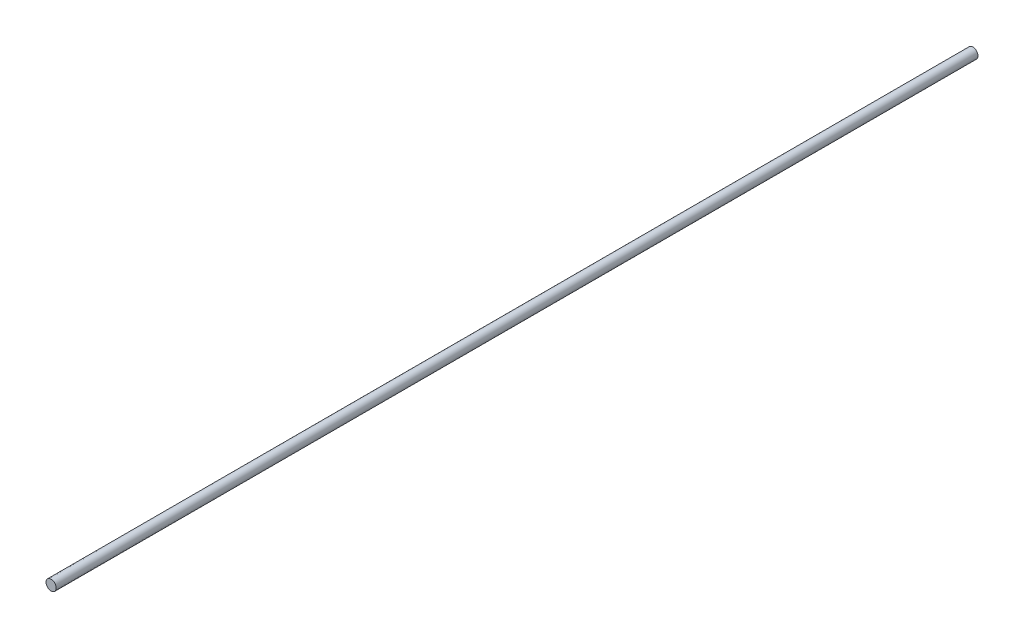
ISO-10303-21;
HEADER;
FILE_DESCRIPTION(('STEP AP214'),'2;1');
FILE_NAME('part.step','',(''),(''),'','','');
FILE_SCHEMA(('AUTOMOTIVE_DESIGN { 1 0 10303 214 1 1 1 1 }'));
ENDSEC;
DATA;
#1=APPLICATION_CONTEXT('core data for automotive mechanical design processes');
#2=APPLICATION_PROTOCOL_DEFINITION('international standard','automotive_design',2000,#1);
#3=PRODUCT_CONTEXT('',#1,'mechanical');
#4=PRODUCT('Part','Part','',(#3));
#5=PRODUCT_RELATED_PRODUCT_CATEGORY('part','',(#4));
#6=PRODUCT_DEFINITION_FORMATION('','',#4);
#7=PRODUCT_DEFINITION_CONTEXT('part definition',#1,'design');
#8=PRODUCT_DEFINITION('design','',#6,#7);
#9=PRODUCT_DEFINITION_SHAPE('','',#8);
#10=(LENGTH_UNIT() NAMED_UNIT(*) SI_UNIT(.MILLI.,.METRE.));
#11=(NAMED_UNIT(*) PLANE_ANGLE_UNIT() SI_UNIT($,.RADIAN.));
#12=(NAMED_UNIT(*) SI_UNIT($,.STERADIAN.) SOLID_ANGLE_UNIT());
#13=UNCERTAINTY_MEASURE_WITH_UNIT(LENGTH_MEASURE(1.E-05),#10,'distance_accuracy_value','');
#14=(GEOMETRIC_REPRESENTATION_CONTEXT(3) GLOBAL_UNCERTAINTY_ASSIGNED_CONTEXT((#13)) GLOBAL_UNIT_ASSIGNED_CONTEXT((#10,
#11,#12)) REPRESENTATION_CONTEXT('',''));
#15=CARTESIAN_POINT('',(0.,0.,0.));
#16=DIRECTION('',(0.,0.,1.));
#17=DIRECTION('',(1.,0.,0.));
#18=AXIS2_PLACEMENT_3D('',#15,#16,#17);
#19=CARTESIAN_POINT('',(0.,0.,450.));
#20=DIRECTION('',(0.,0.,-1.));
#21=DIRECTION('',(-1.,0.,0.));
#22=AXIS2_PLACEMENT_3D('',#19,#20,#21);
#23=CYLINDRICAL_SURFACE('',#22,5.);
#24=CARTESIAN_POINT('',(0.,0.,450.));
#25=DIRECTION('',(0.,0.,1.));
#26=DIRECTION('',(1.,0.,0.));
#27=AXIS2_PLACEMENT_3D('',#24,#25,#26);
#28=CIRCLE('',#27,5.);
#29=CARTESIAN_POINT('',(5.,0.,450.));
#30=VERTEX_POINT('',#29);
#31=EDGE_CURVE('E10',#30,#30,#28,.T.);
#32=ORIENTED_EDGE('',*,*,#31,.F.);
#33=EDGE_LOOP('',(#32));
#34=FACE_BOUND('',#33,.T.);
#35=CARTESIAN_POINT('',(0.,0.,-450.));
#36=DIRECTION('',(0.,0.,1.));
#37=DIRECTION('',(1.,0.,0.));
#38=AXIS2_PLACEMENT_3D('',#35,#36,#37);
#39=CIRCLE('',#38,5.);
#40=CARTESIAN_POINT('',(5.,0.,-450.));
#41=VERTEX_POINT('',#40);
#42=EDGE_CURVE('E44',#41,#41,#39,.T.);
#43=ORIENTED_EDGE('',*,*,#42,.T.);
#44=EDGE_LOOP('',(#43));
#45=FACE_BOUND('',#44,.T.);
#46=ADVANCED_FACE('F41',(#34,#45),#23,.T.);
#47=CARTESIAN_POINT('',(0.,0.,450.));
#48=DIRECTION('',(0.,0.,1.));
#49=DIRECTION('',(1.,0.,0.));
#50=AXIS2_PLACEMENT_3D('',#47,#48,#49);
#51=PLANE('',#50);
#52=ORIENTED_EDGE('',*,*,#31,.T.);
#53=EDGE_LOOP('',(#52));
#54=FACE_BOUND('',#53,.T.);
#55=ADVANCED_FACE('F58',(#54),#51,.T.);
#56=CARTESIAN_POINT('',(0.,0.,-450.));
#57=DIRECTION('',(0.,0.,1.));
#58=DIRECTION('',(1.,0.,0.));
#59=AXIS2_PLACEMENT_3D('',#56,#57,#58);
#60=PLANE('',#59);
#61=ORIENTED_EDGE('',*,*,#42,.F.);
#62=EDGE_LOOP('',(#61));
#63=FACE_BOUND('',#62,.T.);
#64=ADVANCED_FACE('F56',(#63),#60,.F.);
#65=CLOSED_SHELL('',(#46,#55,#64));
#66=MANIFOLD_SOLID_BREP('B2',#65);
#67=ADVANCED_BREP_SHAPE_REPRESENTATION('',(#18,#66),#14);
#68=SHAPE_DEFINITION_REPRESENTATION(#9,#67);
ENDSEC;
END-ISO-10303-21;
